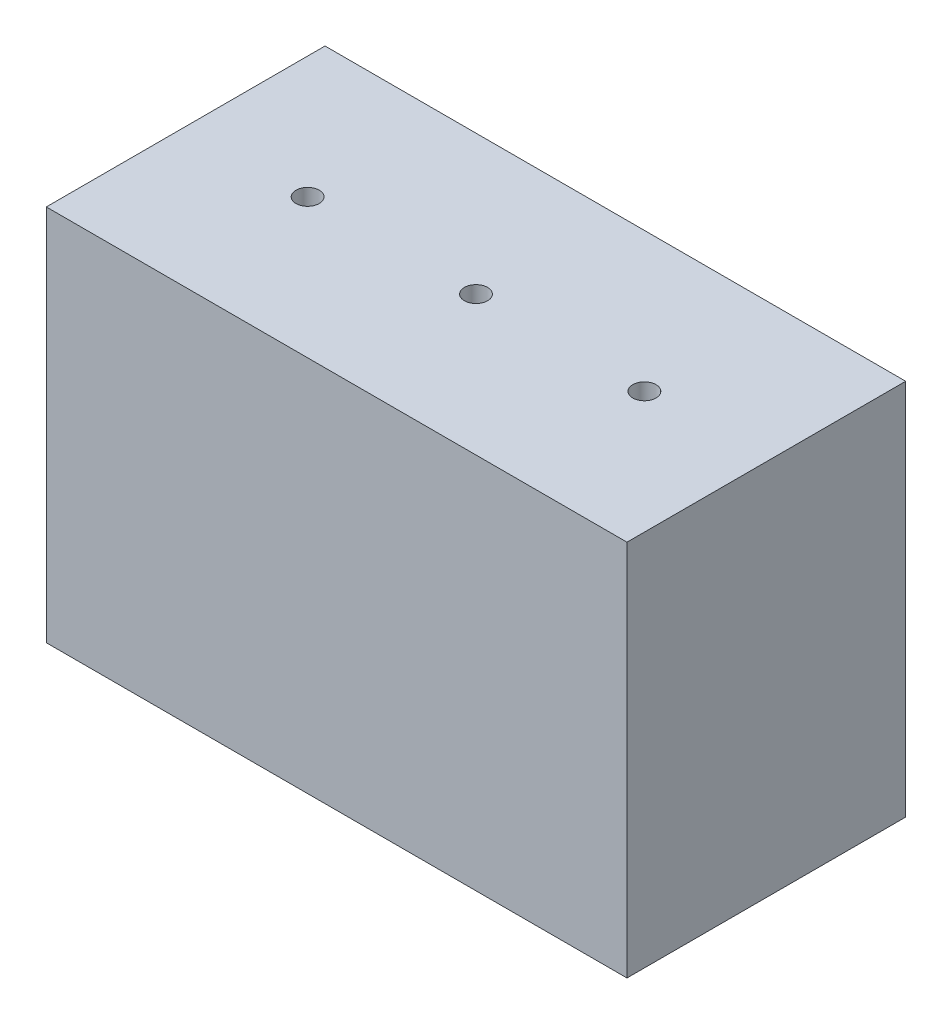
ISO-10303-21;
HEADER;
FILE_DESCRIPTION(('STEP AP214'),'2;1');
FILE_NAME('part.step','',(''),(''),'','','');
FILE_SCHEMA(('AUTOMOTIVE_DESIGN { 1 0 10303 214 1 1 1 1 }'));
ENDSEC;
DATA;
#1=APPLICATION_CONTEXT('core data for automotive mechanical design processes');
#2=APPLICATION_PROTOCOL_DEFINITION('international standard','automotive_design',2000,#1);
#3=PRODUCT_CONTEXT('',#1,'mechanical');
#4=PRODUCT('Part','Part','',(#3));
#5=PRODUCT_RELATED_PRODUCT_CATEGORY('part','',(#4));
#6=PRODUCT_DEFINITION_FORMATION('','',#4);
#7=PRODUCT_DEFINITION_CONTEXT('part definition',#1,'design');
#8=PRODUCT_DEFINITION('design','',#6,#7);
#9=PRODUCT_DEFINITION_SHAPE('','',#8);
#10=(LENGTH_UNIT() NAMED_UNIT(*) SI_UNIT(.MILLI.,.METRE.));
#11=(NAMED_UNIT(*) PLANE_ANGLE_UNIT() SI_UNIT($,.RADIAN.));
#12=(NAMED_UNIT(*) SI_UNIT($,.STERADIAN.) SOLID_ANGLE_UNIT());
#13=UNCERTAINTY_MEASURE_WITH_UNIT(LENGTH_MEASURE(1.E-05),#10,'distance_accuracy_value','');
#14=(GEOMETRIC_REPRESENTATION_CONTEXT(3) GLOBAL_UNCERTAINTY_ASSIGNED_CONTEXT((#13)) GLOBAL_UNIT_ASSIGNED_CONTEXT((#10,
#11,#12)) REPRESENTATION_CONTEXT('',''));
#15=CARTESIAN_POINT('',(0.,0.,0.));
#16=DIRECTION('',(0.,0.,1.));
#17=DIRECTION('',(1.,0.,0.));
#18=AXIS2_PLACEMENT_3D('',#15,#16,#17);
#19=CARTESIAN_POINT('',(50.,-65.,-24.));
#20=DIRECTION('',(1.,0.,0.));
#21=DIRECTION('',(0.,0.,-1.));
#22=AXIS2_PLACEMENT_3D('',#19,#20,#21);
#23=PLANE('',#22);
#24=DIRECTION('',(0.,0.,-1.));
#25=VECTOR('',#24,1.);
#26=CARTESIAN_POINT('',(50.,0.,-24.));
#27=LINE('',#26,#25);
#28=CARTESIAN_POINT('',(50.,0.,24.));
#29=VERTEX_POINT('',#28);
#30=CARTESIAN_POINT('',(50.,0.,-24.));
#31=VERTEX_POINT('',#30);
#32=EDGE_CURVE('E116',#29,#31,#27,.T.);
#33=ORIENTED_EDGE('',*,*,#32,.F.);
#34=DIRECTION('',(0.,1.,0.));
#35=VECTOR('',#34,1.);
#36=CARTESIAN_POINT('',(50.,-65.,24.));
#37=LINE('',#36,#35);
#38=CARTESIAN_POINT('',(50.,-65.,24.));
#39=VERTEX_POINT('',#38);
#40=EDGE_CURVE('E11',#39,#29,#37,.T.);
#41=ORIENTED_EDGE('',*,*,#40,.F.);
#42=DIRECTION('',(0.,0.,-1.));
#43=VECTOR('',#42,1.);
#44=CARTESIAN_POINT('',(50.,-65.,-24.));
#45=LINE('',#44,#43);
#46=CARTESIAN_POINT('',(50.,-65.,-24.));
#47=VERTEX_POINT('',#46);
#48=EDGE_CURVE('E107',#39,#47,#45,.T.);
#49=ORIENTED_EDGE('',*,*,#48,.T.);
#50=DIRECTION('',(0.,1.,0.));
#51=VECTOR('',#50,1.);
#52=CARTESIAN_POINT('',(50.,-65.,-24.));
#53=LINE('',#52,#51);
#54=EDGE_CURVE('E48',#47,#31,#53,.T.);
#55=ORIENTED_EDGE('',*,*,#54,.T.);
#56=EDGE_LOOP('',(#33,#41,#49,#55));
#57=FACE_BOUND('',#56,.T.);
#58=ADVANCED_FACE('F45',(#57),#23,.T.);
#59=CARTESIAN_POINT('',(-50.,-65.,24.));
#60=DIRECTION('',(0.,0.,1.));
#61=DIRECTION('',(1.,0.,0.));
#62=AXIS2_PLACEMENT_3D('',#59,#60,#61);
#63=PLANE('',#62);
#64=DIRECTION('',(1.,0.,0.));
#65=VECTOR('',#64,1.);
#66=CARTESIAN_POINT('',(-50.,0.,24.));
#67=LINE('',#66,#65);
#68=CARTESIAN_POINT('',(-50.,0.,24.));
#69=VERTEX_POINT('',#68);
#70=EDGE_CURVE('E110',#69,#29,#67,.T.);
#71=ORIENTED_EDGE('',*,*,#70,.F.);
#72=DIRECTION('',(0.,1.,0.));
#73=VECTOR('',#72,1.);
#74=CARTESIAN_POINT('',(-50.,-65.,24.));
#75=LINE('',#74,#73);
#76=CARTESIAN_POINT('',(-50.,-65.,24.));
#77=VERTEX_POINT('',#76);
#78=EDGE_CURVE('E55',#77,#69,#75,.T.);
#79=ORIENTED_EDGE('',*,*,#78,.F.);
#80=DIRECTION('',(1.,0.,0.));
#81=VECTOR('',#80,1.);
#82=CARTESIAN_POINT('',(-50.,-65.,24.));
#83=LINE('',#82,#81);
#84=EDGE_CURVE('E102',#77,#39,#83,.T.);
#85=ORIENTED_EDGE('',*,*,#84,.T.);
#86=ORIENTED_EDGE('',*,*,#40,.T.);
#87=EDGE_LOOP('',(#71,#79,#85,#86));
#88=FACE_BOUND('',#87,.T.);
#89=ADVANCED_FACE('F133',(#88),#63,.T.);
#90=CARTESIAN_POINT('',(-50.,-65.,-24.));
#91=DIRECTION('',(-1.,0.,0.));
#92=DIRECTION('',(0.,0.,1.));
#93=AXIS2_PLACEMENT_3D('',#90,#91,#92);
#94=PLANE('',#93);
#95=DIRECTION('',(0.,0.,1.));
#96=VECTOR('',#95,1.);
#97=CARTESIAN_POINT('',(-50.,0.,-24.));
#98=LINE('',#97,#96);
#99=CARTESIAN_POINT('',(-50.,0.,-24.));
#100=VERTEX_POINT('',#99);
#101=EDGE_CURVE('E96',#100,#69,#98,.T.);
#102=ORIENTED_EDGE('',*,*,#101,.F.);
#103=DIRECTION('',(0.,1.,0.));
#104=VECTOR('',#103,1.);
#105=CARTESIAN_POINT('',(-50.,-65.,-24.));
#106=LINE('',#105,#104);
#107=CARTESIAN_POINT('',(-50.,-65.,-24.));
#108=VERTEX_POINT('',#107);
#109=EDGE_CURVE('E91',#108,#100,#106,.T.);
#110=ORIENTED_EDGE('',*,*,#109,.F.);
#111=DIRECTION('',(0.,0.,1.));
#112=VECTOR('',#111,1.);
#113=CARTESIAN_POINT('',(-50.,-65.,-24.));
#114=LINE('',#113,#112);
#115=EDGE_CURVE('E94',#108,#77,#114,.T.);
#116=ORIENTED_EDGE('',*,*,#115,.T.);
#117=ORIENTED_EDGE('',*,*,#78,.T.);
#118=EDGE_LOOP('',(#102,#110,#116,#117));
#119=FACE_BOUND('',#118,.T.);
#120=ADVANCED_FACE('F93',(#119),#94,.T.);
#121=CARTESIAN_POINT('',(-50.,-65.,-24.));
#122=DIRECTION('',(0.,0.,-1.));
#123=DIRECTION('',(-1.,0.,0.));
#124=AXIS2_PLACEMENT_3D('',#121,#122,#123);
#125=PLANE('',#124);
#126=DIRECTION('',(-1.,0.,0.));
#127=VECTOR('',#126,1.);
#128=CARTESIAN_POINT('',(-50.,0.,-24.));
#129=LINE('',#128,#127);
#130=EDGE_CURVE('E120',#31,#100,#129,.T.);
#131=ORIENTED_EDGE('',*,*,#130,.F.);
#132=ORIENTED_EDGE('',*,*,#54,.F.);
#133=DIRECTION('',(-1.,0.,0.));
#134=VECTOR('',#133,1.);
#135=CARTESIAN_POINT('',(-50.,-65.,-24.));
#136=LINE('',#135,#134);
#137=EDGE_CURVE('E101',#47,#108,#136,.T.);
#138=ORIENTED_EDGE('',*,*,#137,.T.);
#139=ORIENTED_EDGE('',*,*,#109,.T.);
#140=EDGE_LOOP('',(#131,#132,#138,#139));
#141=FACE_BOUND('',#140,.T.);
#142=ADVANCED_FACE('F105',(#141),#125,.T.);
#143=CARTESIAN_POINT('',(0.,-65.,0.));
#144=DIRECTION('',(0.,1.,0.));
#145=DIRECTION('',(0.,0.,1.));
#146=AXIS2_PLACEMENT_3D('',#143,#144,#145);
#147=PLANE('',#146);
#148=CARTESIAN_POINT('',(29.,-65.,0.));
#149=DIRECTION('',(0.,1.,0.));
#150=DIRECTION('',(0.,0.,1.));
#151=AXIS2_PLACEMENT_3D('',#148,#149,#150);
#152=CIRCLE('',#151,2.);
#153=CARTESIAN_POINT('',(29.,-65.,2.));
#154=VERTEX_POINT('',#153);
#155=EDGE_CURVE('E170',#154,#154,#152,.T.);
#156=ORIENTED_EDGE('',*,*,#155,.T.);
#157=EDGE_LOOP('',(#156));
#158=FACE_BOUND('',#157,.T.);
#159=CARTESIAN_POINT('',(0.,-65.,0.));
#160=DIRECTION('',(0.,1.,0.));
#161=DIRECTION('',(0.,0.,1.));
#162=AXIS2_PLACEMENT_3D('',#159,#160,#161);
#163=CIRCLE('',#162,2.);
#164=CARTESIAN_POINT('',(0.,-65.,2.));
#165=VERTEX_POINT('',#164);
#166=EDGE_CURVE('E180',#165,#165,#163,.T.);
#167=ORIENTED_EDGE('',*,*,#166,.T.);
#168=EDGE_LOOP('',(#167));
#169=FACE_BOUND('',#168,.T.);
#170=CARTESIAN_POINT('',(-29.,-65.,0.));
#171=DIRECTION('',(0.,1.,0.));
#172=DIRECTION('',(0.,0.,1.));
#173=AXIS2_PLACEMENT_3D('',#170,#171,#172);
#174=CIRCLE('',#173,2.);
#175=CARTESIAN_POINT('',(-29.,-65.,2.));
#176=VERTEX_POINT('',#175);
#177=EDGE_CURVE('E121',#176,#176,#174,.T.);
#178=ORIENTED_EDGE('',*,*,#177,.T.);
#179=EDGE_LOOP('',(#178));
#180=FACE_BOUND('',#179,.T.);
#181=ORIENTED_EDGE('',*,*,#48,.F.);
#182=ORIENTED_EDGE('',*,*,#84,.F.);
#183=ORIENTED_EDGE('',*,*,#115,.F.);
#184=ORIENTED_EDGE('',*,*,#137,.F.);
#185=EDGE_LOOP('',(#181,#182,#183,#184));
#186=FACE_BOUND('',#185,.T.);
#187=ADVANCED_FACE('F100',(#158,#169,#180,#186),#147,.F.);
#188=CARTESIAN_POINT('',(0.,0.,0.));
#189=DIRECTION('',(0.,1.,0.));
#190=DIRECTION('',(0.,0.,1.));
#191=AXIS2_PLACEMENT_3D('',#188,#189,#190);
#192=PLANE('',#191);
#193=CARTESIAN_POINT('',(29.,0.,0.));
#194=DIRECTION('',(0.,1.,0.));
#195=DIRECTION('',(0.,0.,1.));
#196=AXIS2_PLACEMENT_3D('',#193,#194,#195);
#197=CIRCLE('',#196,2.);
#198=CARTESIAN_POINT('',(29.,0.,2.));
#199=VERTEX_POINT('',#198);
#200=EDGE_CURVE('E173',#199,#199,#197,.T.);
#201=ORIENTED_EDGE('',*,*,#200,.F.);
#202=EDGE_LOOP('',(#201));
#203=FACE_BOUND('',#202,.T.);
#204=CARTESIAN_POINT('',(0.,0.,0.));
#205=DIRECTION('',(0.,1.,0.));
#206=DIRECTION('',(0.,0.,1.));
#207=AXIS2_PLACEMENT_3D('',#204,#205,#206);
#208=CIRCLE('',#207,2.);
#209=CARTESIAN_POINT('',(0.,0.,2.));
#210=VERTEX_POINT('',#209);
#211=EDGE_CURVE('E177',#210,#210,#208,.T.);
#212=ORIENTED_EDGE('',*,*,#211,.F.);
#213=EDGE_LOOP('',(#212));
#214=FACE_BOUND('',#213,.T.);
#215=CARTESIAN_POINT('',(-29.,0.,0.));
#216=DIRECTION('',(0.,1.,0.));
#217=DIRECTION('',(0.,0.,1.));
#218=AXIS2_PLACEMENT_3D('',#215,#216,#217);
#219=CIRCLE('',#218,2.);
#220=CARTESIAN_POINT('',(-29.,0.,2.));
#221=VERTEX_POINT('',#220);
#222=EDGE_CURVE('E184',#221,#221,#219,.T.);
#223=ORIENTED_EDGE('',*,*,#222,.F.);
#224=EDGE_LOOP('',(#223));
#225=FACE_BOUND('',#224,.T.);
#226=ORIENTED_EDGE('',*,*,#32,.T.);
#227=ORIENTED_EDGE('',*,*,#130,.T.);
#228=ORIENTED_EDGE('',*,*,#101,.T.);
#229=ORIENTED_EDGE('',*,*,#70,.T.);
#230=EDGE_LOOP('',(#226,#227,#228,#229));
#231=FACE_BOUND('',#230,.T.);
#232=ADVANCED_FACE('F132',(#203,#214,#225,#231),#192,.T.);
#233=CARTESIAN_POINT('',(-29.,-65.,0.));
#234=DIRECTION('',(0.,1.,0.));
#235=DIRECTION('',(0.,0.,1.));
#236=AXIS2_PLACEMENT_3D('',#233,#234,#235);
#237=CYLINDRICAL_SURFACE('',#236,2.);
#238=ORIENTED_EDGE('',*,*,#177,.F.);
#239=EDGE_LOOP('',(#238));
#240=FACE_BOUND('',#239,.T.);
#241=ORIENTED_EDGE('',*,*,#222,.T.);
#242=EDGE_LOOP('',(#241));
#243=FACE_BOUND('',#242,.T.);
#244=ADVANCED_FACE('F151',(#240,#243),#237,.F.);
#245=CARTESIAN_POINT('',(0.,-65.,0.));
#246=DIRECTION('',(0.,1.,0.));
#247=DIRECTION('',(0.,0.,1.));
#248=AXIS2_PLACEMENT_3D('',#245,#246,#247);
#249=CYLINDRICAL_SURFACE('',#248,2.);
#250=ORIENTED_EDGE('',*,*,#166,.F.);
#251=EDGE_LOOP('',(#250));
#252=FACE_BOUND('',#251,.T.);
#253=ORIENTED_EDGE('',*,*,#211,.T.);
#254=EDGE_LOOP('',(#253));
#255=FACE_BOUND('',#254,.T.);
#256=ADVANCED_FACE('F158',(#252,#255),#249,.F.);
#257=CARTESIAN_POINT('',(29.,-65.,0.));
#258=DIRECTION('',(0.,1.,0.));
#259=DIRECTION('',(0.,0.,1.));
#260=AXIS2_PLACEMENT_3D('',#257,#258,#259);
#261=CYLINDRICAL_SURFACE('',#260,2.);
#262=ORIENTED_EDGE('',*,*,#155,.F.);
#263=EDGE_LOOP('',(#262));
#264=FACE_BOUND('',#263,.T.);
#265=ORIENTED_EDGE('',*,*,#200,.T.);
#266=EDGE_LOOP('',(#265));
#267=FACE_BOUND('',#266,.T.);
#268=ADVANCED_FACE('F162',(#264,#267),#261,.F.);
#269=CLOSED_SHELL('',(#58,#89,#120,#142,#187,#232,#244,#256,#268));
#270=MANIFOLD_SOLID_BREP('B2',#269);
#271=ADVANCED_BREP_SHAPE_REPRESENTATION('',(#18,#270),#14);
#272=SHAPE_DEFINITION_REPRESENTATION(#9,#271);
ENDSEC;
END-ISO-10303-21;
